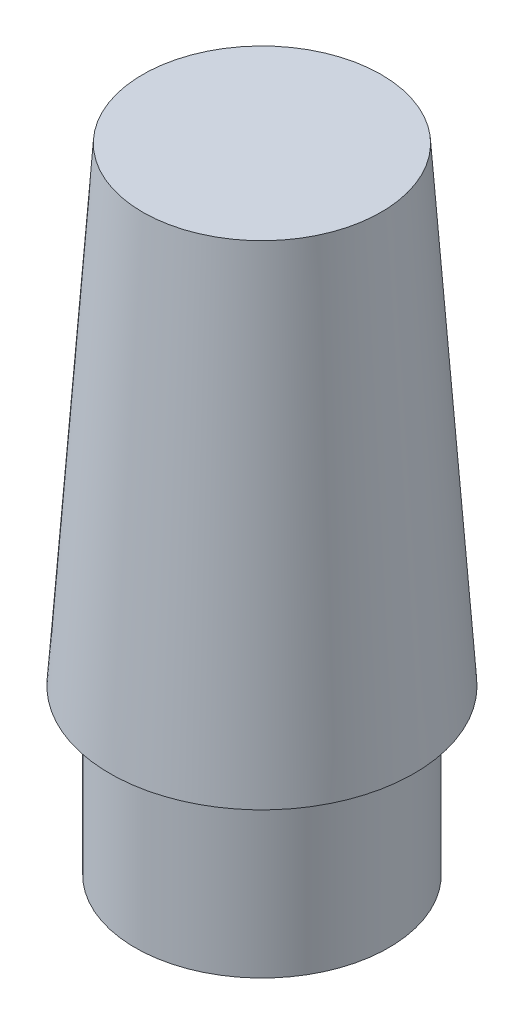
ISO-10303-21;
HEADER;
FILE_DESCRIPTION(('STEP AP214'),'2;1');
FILE_NAME('part.step','',(''),(''),'','','');
FILE_SCHEMA(('AUTOMOTIVE_DESIGN { 1 0 10303 214 1 1 1 1 }'));
ENDSEC;
DATA;
#1=APPLICATION_CONTEXT('core data for automotive mechanical design processes');
#2=APPLICATION_PROTOCOL_DEFINITION('international standard','automotive_design',2000,#1);
#3=PRODUCT_CONTEXT('',#1,'mechanical');
#4=PRODUCT('Part','Part','',(#3));
#5=PRODUCT_RELATED_PRODUCT_CATEGORY('part','',(#4));
#6=PRODUCT_DEFINITION_FORMATION('','',#4);
#7=PRODUCT_DEFINITION_CONTEXT('part definition',#1,'design');
#8=PRODUCT_DEFINITION('design','',#6,#7);
#9=PRODUCT_DEFINITION_SHAPE('','',#8);
#10=(LENGTH_UNIT() NAMED_UNIT(*) SI_UNIT(.MILLI.,.METRE.));
#11=(NAMED_UNIT(*) PLANE_ANGLE_UNIT() SI_UNIT($,.RADIAN.));
#12=(NAMED_UNIT(*) SI_UNIT($,.STERADIAN.) SOLID_ANGLE_UNIT());
#13=UNCERTAINTY_MEASURE_WITH_UNIT(LENGTH_MEASURE(1.E-05),#10,'distance_accuracy_value','');
#14=(GEOMETRIC_REPRESENTATION_CONTEXT(3) GLOBAL_UNCERTAINTY_ASSIGNED_CONTEXT((#13)) GLOBAL_UNIT_ASSIGNED_CONTEXT((#10,
#11,#12)) REPRESENTATION_CONTEXT('',''));
#15=CARTESIAN_POINT('',(0.,0.,0.));
#16=DIRECTION('',(0.,0.,1.));
#17=DIRECTION('',(1.,0.,0.));
#18=AXIS2_PLACEMENT_3D('',#15,#16,#17);
#19=CARTESIAN_POINT('',(0.,16.5,0.));
#20=DIRECTION('',(0.,-1.,0.));
#21=DIRECTION('',(0.,0.,-1.));
#22=AXIS2_PLACEMENT_3D('',#19,#20,#21);
#23=CONICAL_SURFACE('',#22,15.35,0.0698131700797733);
#24=CARTESIAN_POINT('',(0.,63.9,0.));
#25=DIRECTION('',(0.,1.,0.));
#26=DIRECTION('',(0.,0.,1.));
#27=AXIS2_PLACEMENT_3D('',#24,#25,#26);
#28=CIRCLE('',#27,12.0354691138776);
#29=CARTESIAN_POINT('',(0.,63.9,12.0354691138776));
#30=VERTEX_POINT('',#29);
#31=EDGE_CURVE('E11',#30,#30,#28,.T.);
#32=ORIENTED_EDGE('',*,*,#31,.F.);
#33=EDGE_LOOP('',(#32));
#34=FACE_BOUND('',#33,.T.);
#35=CARTESIAN_POINT('',(0.,16.5,0.));
#36=DIRECTION('',(0.,-1.,0.));
#37=DIRECTION('',(0.,0.,-1.));
#38=AXIS2_PLACEMENT_3D('',#35,#36,#37);
#39=CIRCLE('',#38,15.35);
#40=CARTESIAN_POINT('',(0.,16.5,-15.35));
#41=VERTEX_POINT('',#40);
#42=EDGE_CURVE('E68',#41,#41,#39,.T.);
#43=ORIENTED_EDGE('',*,*,#42,.F.);
#44=EDGE_LOOP('',(#43));
#45=FACE_BOUND('',#44,.T.);
#46=ADVANCED_FACE('F33',(#34,#45),#23,.T.);
#47=CARTESIAN_POINT('',(0.,63.9,0.));
#48=DIRECTION('',(0.,1.,0.));
#49=DIRECTION('',(0.,0.,1.));
#50=AXIS2_PLACEMENT_3D('',#47,#48,#49);
#51=PLANE('',#50);
#52=ORIENTED_EDGE('',*,*,#31,.T.);
#53=EDGE_LOOP('',(#52));
#54=FACE_BOUND('',#53,.T.);
#55=ADVANCED_FACE('F83',(#54),#51,.T.);
#56=CARTESIAN_POINT('',(-10.8,16.5,0.));
#57=DIRECTION('',(1.,0.,0.));
#58=DIRECTION('',(0.,0.,-1.));
#59=AXIS2_PLACEMENT_3D('',#56,#57,#58);
#60=PLANE('',#59);
#61=DIRECTION('',(0.,0.,1.));
#62=VECTOR('',#61,1.);
#63=CARTESIAN_POINT('',(-10.8,0.,0.));
#64=LINE('',#63,#62);
#65=CARTESIAN_POINT('',(-10.8,0.,-6.87022561492706));
#66=VERTEX_POINT('',#65);
#67=CARTESIAN_POINT('',(-10.8,0.,6.87022561492706));
#68=VERTEX_POINT('',#67);
#69=EDGE_CURVE('E47',#66,#68,#64,.T.);
#70=ORIENTED_EDGE('',*,*,#69,.T.);
#71=DIRECTION('',(0.,-1.,0.));
#72=VECTOR('',#71,1.);
#73=CARTESIAN_POINT('',(-10.8,16.5,6.87022561492706));
#74=LINE('',#73,#72);
#75=CARTESIAN_POINT('',(-10.8,16.5,6.87022561492706));
#76=VERTEX_POINT('',#75);
#77=EDGE_CURVE('E62',#76,#68,#74,.T.);
#78=ORIENTED_EDGE('',*,*,#77,.F.);
#79=DIRECTION('',(0.,0.,1.));
#80=VECTOR('',#79,1.);
#81=CARTESIAN_POINT('',(-10.8,16.5,0.));
#82=LINE('',#81,#80);
#83=CARTESIAN_POINT('',(-10.8,16.5,-6.87022561492706));
#84=VERTEX_POINT('',#83);
#85=EDGE_CURVE('E60',#84,#76,#82,.T.);
#86=ORIENTED_EDGE('',*,*,#85,.F.);
#87=DIRECTION('',(0.,-1.,0.));
#88=VECTOR('',#87,1.);
#89=CARTESIAN_POINT('',(-10.8,16.5,-6.87022561492706));
#90=LINE('',#89,#88);
#91=EDGE_CURVE('E40',#84,#66,#90,.T.);
#92=ORIENTED_EDGE('',*,*,#91,.T.);
#93=EDGE_LOOP('',(#70,#78,#86,#92));
#94=FACE_BOUND('',#93,.T.);
#95=ADVANCED_FACE('F58',(#94),#60,.F.);
#96=CARTESIAN_POINT('',(0.,16.5,0.));
#97=DIRECTION('',(0.,-1.,0.));
#98=DIRECTION('',(0.,0.,-1.));
#99=AXIS2_PLACEMENT_3D('',#96,#97,#98);
#100=CYLINDRICAL_SURFACE('',#99,12.8);
#101=CARTESIAN_POINT('',(0.,0.,0.));
#102=DIRECTION('',(0.,-1.,0.));
#103=DIRECTION('',(0.,0.,-1.));
#104=AXIS2_PLACEMENT_3D('',#101,#102,#103);
#105=CIRCLE('',#104,12.8);
#106=EDGE_CURVE('E65',#68,#66,#105,.F.);
#107=ORIENTED_EDGE('',*,*,#106,.T.);
#108=ORIENTED_EDGE('',*,*,#91,.F.);
#109=CARTESIAN_POINT('',(0.,16.5,0.));
#110=DIRECTION('',(0.,-1.,0.));
#111=DIRECTION('',(0.,0.,-1.));
#112=AXIS2_PLACEMENT_3D('',#109,#110,#111);
#113=CIRCLE('',#112,12.8);
#114=EDGE_CURVE('E73',#76,#84,#113,.F.);
#115=ORIENTED_EDGE('',*,*,#114,.F.);
#116=ORIENTED_EDGE('',*,*,#77,.T.);
#117=EDGE_LOOP('',(#107,#108,#115,#116));
#118=FACE_BOUND('',#117,.T.);
#119=ADVANCED_FACE('F66',(#118),#100,.T.);
#120=CARTESIAN_POINT('',(0.,16.5,0.));
#121=DIRECTION('',(0.,-1.,0.));
#122=DIRECTION('',(0.,0.,-1.));
#123=AXIS2_PLACEMENT_3D('',#120,#121,#122);
#124=PLANE('',#123);
#125=ORIENTED_EDGE('',*,*,#42,.T.);
#126=EDGE_LOOP('',(#125));
#127=FACE_BOUND('',#126,.T.);
#128=ORIENTED_EDGE('',*,*,#85,.T.);
#129=ORIENTED_EDGE('',*,*,#114,.T.);
#130=EDGE_LOOP('',(#128,#129));
#131=FACE_BOUND('',#130,.T.);
#132=ADVANCED_FACE('F80',(#127,#131),#124,.T.);
#133=CARTESIAN_POINT('',(0.,0.,0.));
#134=DIRECTION('',(0.,1.,0.));
#135=DIRECTION('',(0.,0.,1.));
#136=AXIS2_PLACEMENT_3D('',#133,#134,#135);
#137=PLANE('',#136);
#138=ORIENTED_EDGE('',*,*,#106,.F.);
#139=ORIENTED_EDGE('',*,*,#69,.F.);
#140=EDGE_LOOP('',(#138,#139));
#141=FACE_BOUND('',#140,.T.);
#142=ADVANCED_FACE('F70',(#141),#137,.F.);
#143=CLOSED_SHELL('',(#46,#55,#95,#119,#132,#142));
#144=MANIFOLD_SOLID_BREP('B2',#143);
#145=ADVANCED_BREP_SHAPE_REPRESENTATION('',(#18,#144),#14);
#146=SHAPE_DEFINITION_REPRESENTATION(#9,#145);
ENDSEC;
END-ISO-10303-21;
